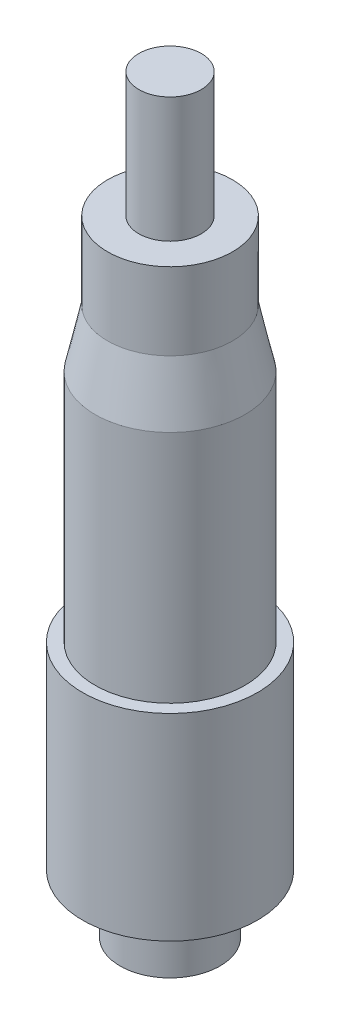
ISO-10303-21;
HEADER;
FILE_DESCRIPTION(('STEP AP214'),'2;1');
FILE_NAME('part.step','',(''),(''),'','','');
FILE_SCHEMA(('AUTOMOTIVE_DESIGN { 1 0 10303 214 1 1 1 1 }'));
ENDSEC;
DATA;
#1=APPLICATION_CONTEXT('core data for automotive mechanical design processes');
#2=APPLICATION_PROTOCOL_DEFINITION('international standard','automotive_design',2000,#1);
#3=PRODUCT_CONTEXT('',#1,'mechanical');
#4=PRODUCT('Part','Part','',(#3));
#5=PRODUCT_RELATED_PRODUCT_CATEGORY('part','',(#4));
#6=PRODUCT_DEFINITION_FORMATION('','',#4);
#7=PRODUCT_DEFINITION_CONTEXT('part definition',#1,'design');
#8=PRODUCT_DEFINITION('design','',#6,#7);
#9=PRODUCT_DEFINITION_SHAPE('','',#8);
#10=(LENGTH_UNIT() NAMED_UNIT(*) SI_UNIT(.MILLI.,.METRE.));
#11=(NAMED_UNIT(*) PLANE_ANGLE_UNIT() SI_UNIT($,.RADIAN.));
#12=(NAMED_UNIT(*) SI_UNIT($,.STERADIAN.) SOLID_ANGLE_UNIT());
#13=UNCERTAINTY_MEASURE_WITH_UNIT(LENGTH_MEASURE(1.E-05),#10,'distance_accuracy_value','');
#14=(GEOMETRIC_REPRESENTATION_CONTEXT(3) GLOBAL_UNCERTAINTY_ASSIGNED_CONTEXT((#13)) GLOBAL_UNIT_ASSIGNED_CONTEXT((#10,
#11,#12)) REPRESENTATION_CONTEXT('',''));
#15=CARTESIAN_POINT('',(0.,0.,0.));
#16=DIRECTION('',(0.,0.,1.));
#17=DIRECTION('',(1.,0.,0.));
#18=AXIS2_PLACEMENT_3D('',#15,#16,#17);
#19=CARTESIAN_POINT('',(0.,60.,0.));
#20=DIRECTION('',(0.,1.,0.));
#21=DIRECTION('',(0.,0.,1.));
#22=AXIS2_PLACEMENT_3D('',#19,#20,#21);
#23=PLANE('',#22);
#24=CARTESIAN_POINT('',(0.,60.,0.));
#25=DIRECTION('',(0.,-1.,0.));
#26=DIRECTION('',(0.,0.,-1.));
#27=AXIS2_PLACEMENT_3D('',#24,#25,#26);
#28=CIRCLE('',#27,2.5);
#29=CARTESIAN_POINT('',(0.,60.,-2.5));
#30=VERTEX_POINT('',#29);
#31=EDGE_CURVE('E10',#30,#30,#28,.T.);
#32=ORIENTED_EDGE('',*,*,#31,.F.);
#33=EDGE_LOOP('',(#32));
#34=FACE_BOUND('',#33,.T.);
#35=ADVANCED_FACE('F31',(#34),#23,.T.);
#36=CARTESIAN_POINT('',(0.,0.,0.));
#37=DIRECTION('',(0.,-1.,0.));
#38=DIRECTION('',(0.,0.,-1.));
#39=AXIS2_PLACEMENT_3D('',#36,#37,#38);
#40=CYLINDRICAL_SURFACE('',#39,2.5);
#41=ORIENTED_EDGE('',*,*,#31,.T.);
#42=EDGE_LOOP('',(#41));
#43=FACE_BOUND('',#42,.T.);
#44=CARTESIAN_POINT('',(0.,50.,0.));
#45=DIRECTION('',(0.,-1.,0.));
#46=DIRECTION('',(0.,0.,-1.));
#47=AXIS2_PLACEMENT_3D('',#44,#45,#46);
#48=CIRCLE('',#47,2.5);
#49=CARTESIAN_POINT('',(0.,50.,-2.5));
#50=VERTEX_POINT('',#49);
#51=EDGE_CURVE('E37',#50,#50,#48,.T.);
#52=ORIENTED_EDGE('',*,*,#51,.F.);
#53=EDGE_LOOP('',(#52));
#54=FACE_BOUND('',#53,.T.);
#55=ADVANCED_FACE('F85',(#43,#54),#40,.T.);
#56=CARTESIAN_POINT('',(2.5,50.,0.));
#57=DIRECTION('',(0.,1.,0.));
#58=DIRECTION('',(0.,0.,1.));
#59=AXIS2_PLACEMENT_3D('',#56,#57,#58);
#60=PLANE('',#59);
#61=ORIENTED_EDGE('',*,*,#51,.T.);
#62=EDGE_LOOP('',(#61));
#63=FACE_BOUND('',#62,.T.);
#64=CARTESIAN_POINT('',(0.,50.,0.));
#65=DIRECTION('',(0.,-1.,0.));
#66=DIRECTION('',(0.,0.,-1.));
#67=AXIS2_PLACEMENT_3D('',#64,#65,#66);
#68=CIRCLE('',#67,5.);
#69=CARTESIAN_POINT('',(0.,50.,-5.));
#70=VERTEX_POINT('',#69);
#71=EDGE_CURVE('E41',#70,#70,#68,.T.);
#72=ORIENTED_EDGE('',*,*,#71,.F.);
#73=EDGE_LOOP('',(#72));
#74=FACE_BOUND('',#73,.T.);
#75=ADVANCED_FACE('F90',(#63,#74),#60,.T.);
#76=CARTESIAN_POINT('',(0.,0.,0.));
#77=DIRECTION('',(0.,-1.,0.));
#78=DIRECTION('',(0.,0.,-1.));
#79=AXIS2_PLACEMENT_3D('',#76,#77,#78);
#80=CYLINDRICAL_SURFACE('',#79,5.);
#81=ORIENTED_EDGE('',*,*,#71,.T.);
#82=EDGE_LOOP('',(#81));
#83=FACE_BOUND('',#82,.T.);
#84=CARTESIAN_POINT('',(0.,43.8190954773861,0.));
#85=DIRECTION('',(0.,-1.,0.));
#86=DIRECTION('',(0.,0.,-1.));
#87=AXIS2_PLACEMENT_3D('',#84,#85,#86);
#88=CIRCLE('',#87,5.);
#89=CARTESIAN_POINT('',(0.,43.8190954773861,-5.));
#90=VERTEX_POINT('',#89);
#91=EDGE_CURVE('E45',#90,#90,#88,.T.);
#92=ORIENTED_EDGE('',*,*,#91,.F.);
#93=EDGE_LOOP('',(#92));
#94=FACE_BOUND('',#93,.T.);
#95=ADVANCED_FACE('F94',(#83,#94),#80,.T.);
#96=CARTESIAN_POINT('',(0.,39.2211055276367,0.));
#97=DIRECTION('',(0.,-1.,0.));
#98=DIRECTION('',(0.,0.,-1.));
#99=AXIS2_PLACEMENT_3D('',#96,#97,#98);
#100=CONICAL_SURFACE('',#99,6.,0.214151427665178);
#101=ORIENTED_EDGE('',*,*,#91,.T.);
#102=EDGE_LOOP('',(#101));
#103=FACE_BOUND('',#102,.T.);
#104=CARTESIAN_POINT('',(0.,39.2211055276367,0.));
#105=DIRECTION('',(0.,-1.,0.));
#106=DIRECTION('',(0.,0.,-1.));
#107=AXIS2_PLACEMENT_3D('',#104,#105,#106);
#108=CIRCLE('',#107,6.);
#109=CARTESIAN_POINT('',(0.,39.2211055276367,-6.));
#110=VERTEX_POINT('',#109);
#111=EDGE_CURVE('E50',#110,#110,#108,.T.);
#112=ORIENTED_EDGE('',*,*,#111,.F.);
#113=EDGE_LOOP('',(#112));
#114=FACE_BOUND('',#113,.T.);
#115=ADVANCED_FACE('F100',(#103,#114),#100,.T.);
#116=CARTESIAN_POINT('',(0.,0.,0.));
#117=DIRECTION('',(0.,-1.,0.));
#118=DIRECTION('',(0.,0.,-1.));
#119=AXIS2_PLACEMENT_3D('',#116,#117,#118);
#120=CYLINDRICAL_SURFACE('',#119,6.);
#121=ORIENTED_EDGE('',*,*,#111,.T.);
#122=EDGE_LOOP('',(#121));
#123=FACE_BOUND('',#122,.T.);
#124=CARTESIAN_POINT('',(0.,20.4522613065285,0.));
#125=DIRECTION('',(0.,-1.,0.));
#126=DIRECTION('',(0.,0.,-1.));
#127=AXIS2_PLACEMENT_3D('',#124,#125,#126);
#128=CIRCLE('',#127,6.);
#129=CARTESIAN_POINT('',(0.,20.4522613065285,-6.));
#130=VERTEX_POINT('',#129);
#131=EDGE_CURVE('E53',#130,#130,#128,.T.);
#132=ORIENTED_EDGE('',*,*,#131,.F.);
#133=EDGE_LOOP('',(#132));
#134=FACE_BOUND('',#133,.T.);
#135=ADVANCED_FACE('F104',(#123,#134),#120,.T.);
#136=CARTESIAN_POINT('',(6.,20.4522613065285,0.));
#137=DIRECTION('',(0.,1.,0.));
#138=DIRECTION('',(0.,0.,1.));
#139=AXIS2_PLACEMENT_3D('',#136,#137,#138);
#140=PLANE('',#139);
#141=ORIENTED_EDGE('',*,*,#131,.T.);
#142=EDGE_LOOP('',(#141));
#143=FACE_BOUND('',#142,.T.);
#144=CARTESIAN_POINT('',(0.,20.4522613065285,0.));
#145=DIRECTION('',(0.,-1.,0.));
#146=DIRECTION('',(0.,0.,-1.));
#147=AXIS2_PLACEMENT_3D('',#144,#145,#146);
#148=CIRCLE('',#147,7.);
#149=CARTESIAN_POINT('',(0.,20.4522613065285,-7.));
#150=VERTEX_POINT('',#149);
#151=EDGE_CURVE('E56',#150,#150,#148,.T.);
#152=ORIENTED_EDGE('',*,*,#151,.F.);
#153=EDGE_LOOP('',(#152));
#154=FACE_BOUND('',#153,.T.);
#155=ADVANCED_FACE('F108',(#143,#154),#140,.T.);
#156=CARTESIAN_POINT('',(0.,0.,0.));
#157=DIRECTION('',(0.,-1.,0.));
#158=DIRECTION('',(0.,0.,-1.));
#159=AXIS2_PLACEMENT_3D('',#156,#157,#158);
#160=CYLINDRICAL_SURFACE('',#159,7.);
#161=ORIENTED_EDGE('',*,*,#151,.T.);
#162=EDGE_LOOP('',(#161));
#163=FACE_BOUND('',#162,.T.);
#164=CARTESIAN_POINT('',(0.,4.67336683417149,0.));
#165=DIRECTION('',(0.,-1.,0.));
#166=DIRECTION('',(0.,0.,-1.));
#167=AXIS2_PLACEMENT_3D('',#164,#165,#166);
#168=CIRCLE('',#167,7.);
#169=CARTESIAN_POINT('',(0.,4.67336683417149,-7.));
#170=VERTEX_POINT('',#169);
#171=EDGE_CURVE('E59',#170,#170,#168,.T.);
#172=ORIENTED_EDGE('',*,*,#171,.F.);
#173=EDGE_LOOP('',(#172));
#174=FACE_BOUND('',#173,.T.);
#175=ADVANCED_FACE('F81',(#163,#174),#160,.T.);
#176=CARTESIAN_POINT('',(7.,4.67336683417149,0.));
#177=DIRECTION('',(0.,-1.,0.));
#178=DIRECTION('',(0.,0.,-1.));
#179=AXIS2_PLACEMENT_3D('',#176,#177,#178);
#180=PLANE('',#179);
#181=ORIENTED_EDGE('',*,*,#171,.T.);
#182=EDGE_LOOP('',(#181));
#183=FACE_BOUND('',#182,.T.);
#184=CARTESIAN_POINT('',(0.,4.67336683417149,0.));
#185=DIRECTION('',(0.,-1.,0.));
#186=DIRECTION('',(0.,0.,-1.));
#187=AXIS2_PLACEMENT_3D('',#184,#185,#186);
#188=CIRCLE('',#187,4.);
#189=CARTESIAN_POINT('',(0.,4.67336683417149,-4.));
#190=VERTEX_POINT('',#189);
#191=EDGE_CURVE('E62',#190,#190,#188,.T.);
#192=ORIENTED_EDGE('',*,*,#191,.F.);
#193=EDGE_LOOP('',(#192));
#194=FACE_BOUND('',#193,.T.);
#195=ADVANCED_FACE('F73',(#183,#194),#180,.T.);
#196=CARTESIAN_POINT('',(0.,0.,0.));
#197=DIRECTION('',(0.,-1.,0.));
#198=DIRECTION('',(0.,0.,-1.));
#199=AXIS2_PLACEMENT_3D('',#196,#197,#198);
#200=CYLINDRICAL_SURFACE('',#199,4.);
#201=ORIENTED_EDGE('',*,*,#191,.T.);
#202=EDGE_LOOP('',(#201));
#203=FACE_BOUND('',#202,.T.);
#204=CARTESIAN_POINT('',(0.,0.,0.));
#205=DIRECTION('',(0.,-1.,0.));
#206=DIRECTION('',(0.,0.,-1.));
#207=AXIS2_PLACEMENT_3D('',#204,#205,#206);
#208=CIRCLE('',#207,4.);
#209=CARTESIAN_POINT('',(0.,0.,-4.));
#210=VERTEX_POINT('',#209);
#211=EDGE_CURVE('E65',#210,#210,#208,.T.);
#212=ORIENTED_EDGE('',*,*,#211,.F.);
#213=EDGE_LOOP('',(#212));
#214=FACE_BOUND('',#213,.T.);
#215=ADVANCED_FACE('F71',(#203,#214),#200,.T.);
#216=CARTESIAN_POINT('',(4.,0.,0.));
#217=DIRECTION('',(0.,-1.,0.));
#218=DIRECTION('',(0.,0.,-1.));
#219=AXIS2_PLACEMENT_3D('',#216,#217,#218);
#220=PLANE('',#219);
#221=ORIENTED_EDGE('',*,*,#211,.T.);
#222=EDGE_LOOP('',(#221));
#223=FACE_BOUND('',#222,.T.);
#224=ADVANCED_FACE('F69',(#223),#220,.T.);
#225=CLOSED_SHELL('',(#35,#55,#75,#95,#115,#135,#155,#175,#195,#215,#224));
#226=MANIFOLD_SOLID_BREP('B2',#225);
#227=ADVANCED_BREP_SHAPE_REPRESENTATION('',(#18,#226),#14);
#228=SHAPE_DEFINITION_REPRESENTATION(#9,#227);
ENDSEC;
END-ISO-10303-21;
